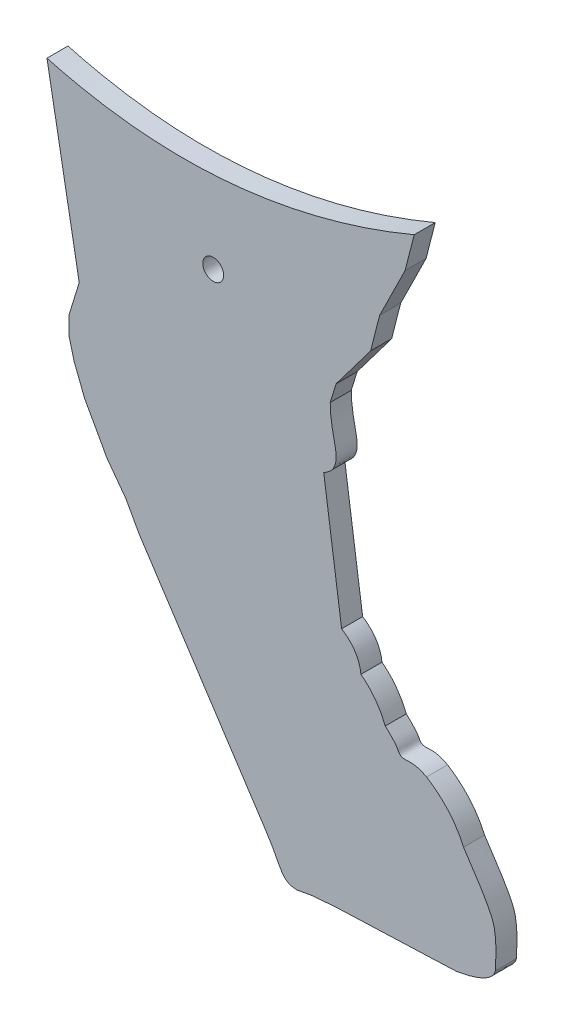
ISO-10303-21;
HEADER;
FILE_DESCRIPTION(('STEP AP214'),'2;1');
FILE_NAME('part.step','',(''),(''),'','','');
FILE_SCHEMA(('AUTOMOTIVE_DESIGN { 1 0 10303 214 1 1 1 1 }'));
ENDSEC;
DATA;
#1=APPLICATION_CONTEXT('core data for automotive mechanical design processes');
#2=APPLICATION_PROTOCOL_DEFINITION('international standard','automotive_design',2000,#1);
#3=PRODUCT_CONTEXT('',#1,'mechanical');
#4=PRODUCT('Part','Part','',(#3));
#5=PRODUCT_RELATED_PRODUCT_CATEGORY('part','',(#4));
#6=PRODUCT_DEFINITION_FORMATION('','',#4);
#7=PRODUCT_DEFINITION_CONTEXT('part definition',#1,'design');
#8=PRODUCT_DEFINITION('design','',#6,#7);
#9=PRODUCT_DEFINITION_SHAPE('','',#8);
#10=(LENGTH_UNIT() NAMED_UNIT(*) SI_UNIT(.MILLI.,.METRE.));
#11=(NAMED_UNIT(*) PLANE_ANGLE_UNIT() SI_UNIT($,.RADIAN.));
#12=(NAMED_UNIT(*) SI_UNIT($,.STERADIAN.) SOLID_ANGLE_UNIT());
#13=UNCERTAINTY_MEASURE_WITH_UNIT(LENGTH_MEASURE(1.E-05),#10,'distance_accuracy_value','');
#14=(GEOMETRIC_REPRESENTATION_CONTEXT(3) GLOBAL_UNCERTAINTY_ASSIGNED_CONTEXT((#13)) GLOBAL_UNIT_ASSIGNED_CONTEXT((#10,
#11,#12)) REPRESENTATION_CONTEXT('',''));
#15=CARTESIAN_POINT('',(0.,0.,0.));
#16=DIRECTION('',(0.,0.,1.));
#17=DIRECTION('',(1.,0.,0.));
#18=AXIS2_PLACEMENT_3D('',#15,#16,#17);
#19=CARTESIAN_POINT('',(117.41123998534,97.4180434664203,3.175));
#20=DIRECTION('',(0.,0.,-1.));
#21=DIRECTION('',(-1.,0.,0.));
#22=AXIS2_PLACEMENT_3D('',#19,#20,#21);
#23=PLANE('',#22);
#24=DIRECTION('',(0.178010170786204,-0.984028647497961,0.));
#25=VECTOR('',#24,1.);
#26=CARTESIAN_POINT('',(95.0150889180373,73.0396220276294,3.175));
#27=LINE('',#26,#25);
#28=CARTESIAN_POINT('',(90.1482637898344,99.9431148301081,3.175));
#29=VERTEX_POINT('',#28);
#30=CARTESIAN_POINT('',(95.0150889180373,73.0396220276294,3.175));
#31=VERTEX_POINT('',#30);
#32=EDGE_CURVE('E49',#29,#31,#27,.T.);
#33=ORIENTED_EDGE('',*,*,#32,.T.);
#34=DIRECTION('',(-0.29507306639433,-0.955474691181639,0.));
#35=VECTOR('',#34,1.);
#36=CARTESIAN_POINT('',(95.0150889180373,73.0396220276294,3.175));
#37=LINE('',#36,#35);
#38=CARTESIAN_POINT('',(93.4424301163472,67.9472030507279,3.175));
#39=VERTEX_POINT('',#38);
#40=EDGE_CURVE('E150',#31,#39,#37,.T.);
#41=ORIENTED_EDGE('',*,*,#40,.T.);
#42=DIRECTION('',(0.,-1.,0.));
#43=VECTOR('',#42,1.);
#44=CARTESIAN_POINT('',(93.4424301163472,67.9472030507279,3.175));
#45=LINE('',#44,#43);
#46=CARTESIAN_POINT('',(93.4424301163472,65.4009935622772,3.175));
#47=VERTEX_POINT('',#46);
#48=EDGE_CURVE('E379',#39,#47,#45,.T.);
#49=ORIENTED_EDGE('',*,*,#48,.T.);
#50=DIRECTION('',(0.253898128412099,-0.967230965379435,0.));
#51=VECTOR('',#50,1.);
#52=CARTESIAN_POINT('',(93.4424301163472,65.4009935622772,3.175));
#53=LINE('',#52,#51);
#54=CARTESIAN_POINT('',(94.2287595171923,62.4054529876292,3.175));
#55=VERTEX_POINT('',#54);
#56=EDGE_CURVE('E510',#47,#55,#53,.T.);
#57=ORIENTED_EDGE('',*,*,#56,.T.);
#58=DIRECTION('',(0.364080080432993,-0.931367647619298,0.));
#59=VECTOR('',#58,1.);
#60=CARTESIAN_POINT('',(94.2287595171923,62.4054529876292,3.175));
#61=LINE('',#60,#59);
#62=CARTESIAN_POINT('',(95.8388625760655,58.2865846974883,3.175));
#63=VERTEX_POINT('',#62);
#64=EDGE_CURVE('E512',#55,#63,#61,.T.);
#65=ORIENTED_EDGE('',*,*,#64,.T.);
#66=DIRECTION('',(0.482604753647132,-0.875838256618875,0.));
#67=VECTOR('',#66,1.);
#68=CARTESIAN_POINT('',(95.8388625760655,58.2865846974883,3.175));
#69=LINE('',#68,#67);
#70=CARTESIAN_POINT('',(99.1877429526815,52.2089869769629,3.175));
#71=VERTEX_POINT('',#70);
#72=EDGE_CURVE('E514',#63,#71,#69,.T.);
#73=ORIENTED_EDGE('',*,*,#72,.T.);
#74=DIRECTION('',(0.594007393769745,-0.804459580182171,0.));
#75=VECTOR('',#74,1.);
#76=CARTESIAN_POINT('',(99.1877429526815,52.2089869769629,3.175));
#77=LINE('',#76,#75);
#78=CARTESIAN_POINT('',(102.05460926846,48.3264122867838,3.175));
#79=VERTEX_POINT('',#78);
#80=EDGE_CURVE('E516',#71,#79,#77,.T.);
#81=ORIENTED_EDGE('',*,*,#80,.T.);
#82=DIRECTION('',(0.482604753647133,-0.875838256618875,0.));
#83=VECTOR('',#82,1.);
#84=CARTESIAN_POINT('',(102.05460926846,48.3264122867838,3.175));
#85=LINE('',#84,#83);
#86=CARTESIAN_POINT('',(104.044945001553,44.7143215119114,3.175));
#87=VERTEX_POINT('',#86);
#88=EDGE_CURVE('E518',#79,#87,#85,.T.);
#89=ORIENTED_EDGE('',*,*,#88,.T.);
#90=DIRECTION('',(0.547838296173329,-0.836584246352932,0.));
#91=VECTOR('',#90,1.);
#92=CARTESIAN_POINT('',(104.044945001553,44.7143215119114,3.175));
#93=LINE('',#92,#91);
#94=CARTESIAN_POINT('',(123.032849585327,15.7185722972348,3.175));
#95=VERTEX_POINT('',#94);
#96=EDGE_CURVE('E520',#87,#95,#93,.T.);
#97=ORIENTED_EDGE('',*,*,#96,.T.);
#98=CARTESIAN_POINT('',(123.032849585327,15.7185722972348,3.175));
#99=CARTESIAN_POINT('',(123.714332190955,14.7231725745055,3.175));
#100=CARTESIAN_POINT('',(125.027867192261,12.4170461110575,3.175));
#101=CARTESIAN_POINT('',(126.131331549657,9.9933385570712,3.175));
#102=CARTESIAN_POINT('',(127.965130811522,10.0937140941964,3.175));
#103=B_SPLINE_CURVE_WITH_KNOTS('',3,(#98,#99,#100,#101,#102),.UNSPECIFIED.,.F.,.F.,(4,1,4),(0.,
0.482545384202542,1.),.UNSPECIFIED.);
#104=CARTESIAN_POINT('',(127.965130811522,10.0937140941964,3.175));
#105=VERTEX_POINT('',#104);
#106=EDGE_CURVE('E522',#95,#105,#103,.T.);
#107=ORIENTED_EDGE('',*,*,#106,.T.);
#108=DIRECTION('',(0.984028647497961,0.178010170786204,0.));
#109=VECTOR('',#108,1.);
#110=CARTESIAN_POINT('',(127.965130811522,10.0937140941964,3.175));
#111=LINE('',#110,#109);
#112=CARTESIAN_POINT('',(130.045906785277,10.4701251747049,3.175));
#113=VERTEX_POINT('',#112);
#114=EDGE_CURVE('E527',#105,#113,#111,.T.);
#115=ORIENTED_EDGE('',*,*,#114,.T.);
#116=DIRECTION('',(0.996703768233982,0.0811270509027666,0.));
#117=VECTOR('',#116,1.);
#118=CARTESIAN_POINT('',(130.045906785277,10.4701251747049,3.175));
#119=LINE('',#118,#117);
#120=CARTESIAN_POINT('',(133.787640511658,10.7746848966196,3.175));
#121=VERTEX_POINT('',#120);
#122=EDGE_CURVE('E585',#113,#121,#119,.T.);
#123=ORIENTED_EDGE('',*,*,#122,.T.);
#124=DIRECTION('',(0.999268220076252,0.0382495012469378,0.));
#125=VECTOR('',#124,1.);
#126=CARTESIAN_POINT('',(133.787640511658,10.7746848966196,3.175));
#127=LINE('',#126,#125);
#128=CARTESIAN_POINT('',(151.974206763138,11.4708214038533,3.175));
#129=VERTEX_POINT('',#128);
#130=EDGE_CURVE('E593',#121,#129,#127,.T.);
#131=ORIENTED_EDGE('',*,*,#130,.T.);
#132=CARTESIAN_POINT('',(151.974206763138,11.4708214038533,3.175));
#133=CARTESIAN_POINT('',(153.413195636641,11.7402218243676,3.175));
#134=CARTESIAN_POINT('',(157.371014602599,12.4486515194922,3.175));
#135=CARTESIAN_POINT('',(157.829388483412,14.5021665055309,3.175));
#136=B_SPLINE_CURVE_WITH_KNOTS('',3,(#132,#133,#134,#135),.UNSPECIFIED.,.F.,.F.,(4,4),(0.,1.),.UNSPECIFIED.);
#137=CARTESIAN_POINT('',(157.829388483412,14.5021665055309,3.175));
#138=VERTEX_POINT('',#137);
#139=EDGE_CURVE('E594',#129,#138,#136,.T.);
#140=ORIENTED_EDGE('',*,*,#139,.T.);
#141=CARTESIAN_POINT('',(157.829388483412,14.5021665055309,3.175));
#142=CARTESIAN_POINT('',(157.900569473778,15.9257863128522,3.175));
#143=CARTESIAN_POINT('',(158.146330260825,19.3120875794455,3.175));
#144=CARTESIAN_POINT('',(156.16856343442,23.6544106319414,3.175));
#145=CARTESIAN_POINT('',(155.053521844869,25.0972584970971,3.175));
#146=CARTESIAN_POINT('',(153.017246456484,28.2462818121606,3.175));
#147=B_SPLINE_CURVE_WITH_KNOTS('',3,(#141,#142,#143,#144,#145,#146),.UNSPECIFIED.,.F.,.F.,(4,1,
1,4),(0.,0.406146074823536,0.454361820832265,1.),.UNSPECIFIED.);
#148=CARTESIAN_POINT('',(153.017246456484,28.2462818121606,3.175));
#149=VERTEX_POINT('',#148);
#150=EDGE_CURVE('E601',#138,#149,#147,.T.);
#151=ORIENTED_EDGE('',*,*,#150,.T.);
#152=CARTESIAN_POINT('',(153.017246456484,28.2462818121606,3.175));
#153=CARTESIAN_POINT('',(151.311718476034,32.1818133798678,3.175));
#154=CARTESIAN_POINT('',(147.43730753607,34.6374390405588,3.175));
#155=B_SPLINE_CURVE_WITH_KNOTS('',2,(#152,#153,#154),.UNSPECIFIED.,.F.,.F.,(3,3),(0.,1.),.UNSPECIFIED.);
#156=CARTESIAN_POINT('',(147.43730753607,34.6374390405588,3.175));
#157=VERTEX_POINT('',#156);
#158=EDGE_CURVE('E850',#149,#157,#155,.T.);
#159=ORIENTED_EDGE('',*,*,#158,.T.);
#160=CARTESIAN_POINT('',(147.43730753607,34.6374390405588,3.175));
#161=CARTESIAN_POINT('',(144.80785202241,36.0573450179352,3.175));
#162=CARTESIAN_POINT('',(143.864835089024,34.5581370649068,3.175));
#163=CARTESIAN_POINT('',(142.696530205708,36.8316825647036,3.175));
#164=CARTESIAN_POINT('',(142.057807777284,37.3364441145635,3.175));
#165=CARTESIAN_POINT('',(141.208586266716,38.1802017114105,3.175));
#166=B_SPLINE_CURVE_WITH_KNOTS('',3,(#160,#161,#162,#163,#164,#165),.UNSPECIFIED.,.F.,.F.,(4,1,
1,4),(0.,0.588995486540135,0.612005866871278,1.),.UNSPECIFIED.);
#167=CARTESIAN_POINT('',(141.208586266716,38.1802017114105,3.175));
#168=VERTEX_POINT('',#167);
#169=EDGE_CURVE('E835',#157,#168,#166,.T.);
#170=ORIENTED_EDGE('',*,*,#169,.T.);
#171=CARTESIAN_POINT('',(141.208586266716,38.1802017114105,3.175));
#172=CARTESIAN_POINT('',(139.984101629635,41.2453207408554,3.175));
#173=CARTESIAN_POINT('',(137.53610977751,43.0922610611387,3.175));
#174=B_SPLINE_CURVE_WITH_KNOTS('',2,(#171,#172,#173),.UNSPECIFIED.,.F.,.F.,(3,3),(0.,1.),.UNSPECIFIED.);
#175=CARTESIAN_POINT('',(137.53610977751,43.0922610611387,3.175));
#176=VERTEX_POINT('',#175);
#177=EDGE_CURVE('E834',#168,#176,#174,.T.);
#178=ORIENTED_EDGE('',*,*,#177,.T.);
#179=CARTESIAN_POINT('',(137.53610977751,43.0922610611387,3.175));
#180=CARTESIAN_POINT('',(137.229688432102,45.9166419246655,3.175));
#181=CARTESIAN_POINT('',(134.617377973838,47.5913974281166,3.175));
#182=B_SPLINE_CURVE_WITH_KNOTS('',2,(#179,#180,#181),.UNSPECIFIED.,.F.,.F.,(3,3),(0.,1.),.UNSPECIFIED.);
#183=CARTESIAN_POINT('',(134.617377973838,47.5913974281166,3.175));
#184=VERTEX_POINT('',#183);
#185=EDGE_CURVE('E833',#176,#184,#182,.T.);
#186=ORIENTED_EDGE('',*,*,#185,.T.);
#187=DIRECTION('',(-0.140124805820318,0.990133848928425,0.));
#188=VECTOR('',#187,1.);
#189=CARTESIAN_POINT('',(134.513357881547,48.3264122867838,3.175));
#190=LINE('',#189,#188);
#191=CARTESIAN_POINT('',(131.916773648468,66.6740983065025,3.175));
#192=VERTEX_POINT('',#191);
#193=EDGE_CURVE('E291',#184,#192,#190,.T.);
#194=ORIENTED_EDGE('',*,*,#193,.T.);
#195=CARTESIAN_POINT('',(131.916773648468,66.6740983065025,3.175));
#196=CARTESIAN_POINT('',(133.384180120025,67.4244104898078,3.175));
#197=CARTESIAN_POINT('',(134.383448091869,69.9754885600191,3.175));
#198=CARTESIAN_POINT('',(132.91594865375,73.1978625027874,3.175));
#199=CARTESIAN_POINT('',(132.897509942166,76.3148082465007,3.175));
#200=B_SPLINE_CURVE_WITH_KNOTS('',3,(#195,#196,#197,#198,#199),.UNSPECIFIED.,.F.,.F.,(4,1,4),
(0.,0.424676319605923,1.),.UNSPECIFIED.);
#201=CARTESIAN_POINT('',(132.897509942166,76.3148082465007,3.175));
#202=VERTEX_POINT('',#201);
#203=EDGE_CURVE('E284',#192,#202,#200,.T.);
#204=ORIENTED_EDGE('',*,*,#203,.T.);
#205=DIRECTION('',(0.295073066394331,0.955474691181638,0.));
#206=VECTOR('',#205,1.);
#207=CARTESIAN_POINT('',(133.787640511658,79.1971358048555,3.175));
#208=LINE('',#207,#206);
#209=CARTESIAN_POINT('',(133.787640511658,79.1971358048555,3.175));
#210=VERTEX_POINT('',#209);
#211=EDGE_CURVE('E290',#202,#210,#208,.T.);
#212=ORIENTED_EDGE('',*,*,#211,.T.);
#213=DIRECTION('',(0.6021846555456,0.798356837902342,0.));
#214=VECTOR('',#213,1.);
#215=CARTESIAN_POINT('',(133.787640511658,79.1971358048555,3.175));
#216=LINE('',#215,#214);
#217=CARTESIAN_POINT('',(138.995570312299,86.1016398126663,3.175));
#218=VERTEX_POINT('',#217);
#219=EDGE_CURVE('E297',#210,#218,#216,.T.);
#220=ORIENTED_EDGE('',*,*,#219,.T.);
#221=DIRECTION('',(0.247383245265818,0.968917710624464,0.));
#222=VECTOR('',#221,1.);
#223=CARTESIAN_POINT('',(138.995570312299,86.1016398126663,3.175));
#224=LINE('',#223,#222);
#225=CARTESIAN_POINT('',(140.361296403027,91.4507336680168,3.175));
#226=VERTEX_POINT('',#225);
#227=EDGE_CURVE('E227',#218,#226,#224,.T.);
#228=ORIENTED_EDGE('',*,*,#227,.T.);
#229=DIRECTION('',(0.44371231462562,0.896169281915852,0.));
#230=VECTOR('',#229,1.);
#231=CARTESIAN_POINT('',(140.361296403027,91.4507336680168,3.175));
#232=LINE('',#231,#230);
#233=CARTESIAN_POINT('',(144.200087545617,99.2039705926736,3.175));
#234=VERTEX_POINT('',#233);
#235=EDGE_CURVE('E221',#226,#234,#232,.T.);
#236=ORIENTED_EDGE('',*,*,#235,.T.);
#237=DIRECTION('',(0.247383245265817,0.968917710624464,0.));
#238=VECTOR('',#237,1.);
#239=CARTESIAN_POINT('',(144.200087545617,99.2039705926736,3.175));
#240=LINE('',#239,#238);
#241=CARTESIAN_POINT('',(145.57069602816,104.572187149301,3.175));
#242=VERTEX_POINT('',#241);
#243=EDGE_CURVE('E225',#234,#242,#240,.T.);
#244=ORIENTED_EDGE('',*,*,#243,.T.);
#245=CARTESIAN_POINT('',(145.57069602816,104.572187149301,3.175));
#246=CARTESIAN_POINT('',(116.963000061684,92.5784359431362,3.175));
#247=CARTESIAN_POINT('',(90.1482637898344,99.9431148301081,3.175));
#248=B_SPLINE_CURVE_WITH_KNOTS('',2,(#245,#246,#247),.UNSPECIFIED.,.F.,.F.,(3,3),(0.,1.),.UNSPECIFIED.);
#249=EDGE_CURVE('E240',#242,#29,#248,.T.);
#250=ORIENTED_EDGE('',*,*,#249,.T.);
#251=EDGE_LOOP('',(#33,#41,#49,#57,#65,#73,#81,#89,#97,#107,#115,#123,#131,#140,#151,#159,#170,
#178,#186,#194,#204,#212,#220,#228,#236,#244,#250));
#252=FACE_BOUND('',#251,.T.);
#253=CARTESIAN_POINT('',(115.239537292347,84.8848861814154,3.175));
#254=DIRECTION('',(0.,0.,1.));
#255=DIRECTION('',(1.,0.,0.));
#256=AXIS2_PLACEMENT_3D('',#253,#254,#255);
#257=CIRCLE('',#256,1.5748);
#258=CARTESIAN_POINT('',(116.814337292347,84.8848861814154,3.175));
#259=VERTEX_POINT('',#258);
#260=EDGE_CURVE('E390',#259,#259,#257,.T.);
#261=ORIENTED_EDGE('',*,*,#260,.F.);
#262=EDGE_LOOP('',(#261));
#263=FACE_BOUND('',#262,.T.);
#264=ADVANCED_FACE('F32',(#252,#263),#23,.F.);
#265=CARTESIAN_POINT('',(117.41123998534,97.4180434664203,0.));
#266=DIRECTION('',(0.,0.,-1.));
#267=DIRECTION('',(-1.,0.,0.));
#268=AXIS2_PLACEMENT_3D('',#265,#266,#267);
#269=PLANE('',#268);
#270=DIRECTION('',(-0.29507306639433,-0.955474691181639,0.));
#271=VECTOR('',#270,1.);
#272=CARTESIAN_POINT('',(95.0150889180373,73.0396220276294,0.));
#273=LINE('',#272,#271);
#274=CARTESIAN_POINT('',(95.0150889180373,73.0396220276294,0.));
#275=VERTEX_POINT('',#274);
#276=CARTESIAN_POINT('',(93.4424301163472,67.9472030507279,0.));
#277=VERTEX_POINT('',#276);
#278=EDGE_CURVE('E249',#275,#277,#273,.T.);
#279=ORIENTED_EDGE('',*,*,#278,.F.);
#280=DIRECTION('',(0.178010170786205,-0.984028647497961,0.));
#281=VECTOR('',#280,1.);
#282=CARTESIAN_POINT('',(92.4998069054663,86.9439374157592,0.));
#283=LINE('',#282,#281);
#284=CARTESIAN_POINT('',(90.1482637898344,99.9431148301081,0.));
#285=VERTEX_POINT('',#284);
#286=EDGE_CURVE('E476',#285,#275,#283,.T.);
#287=ORIENTED_EDGE('',*,*,#286,.F.);
#288=CARTESIAN_POINT('',(145.57069602816,104.572187149301,0.));
#289=CARTESIAN_POINT('',(116.963000061684,92.5784359431362,0.));
#290=CARTESIAN_POINT('',(90.1482637898344,99.9431148301081,0.));
#291=B_SPLINE_CURVE_WITH_KNOTS('',2,(#288,#289,#290),.UNSPECIFIED.,.F.,.F.,(3,3),(0.,1.),.UNSPECIFIED.);
#292=CARTESIAN_POINT('',(145.57069602816,104.572187149301,0.));
#293=VERTEX_POINT('',#292);
#294=EDGE_CURVE('E143',#293,#285,#291,.T.);
#295=ORIENTED_EDGE('',*,*,#294,.F.);
#296=DIRECTION('',(0.247383245265817,0.968917710624464,0.));
#297=VECTOR('',#296,1.);
#298=CARTESIAN_POINT('',(144.200087545617,99.2039705926736,0.));
#299=LINE('',#298,#297);
#300=CARTESIAN_POINT('',(144.200087545617,99.2039705926736,0.));
#301=VERTEX_POINT('',#300);
#302=EDGE_CURVE('E136',#301,#293,#299,.T.);
#303=ORIENTED_EDGE('',*,*,#302,.F.);
#304=DIRECTION('',(0.443712314625622,0.896169281915851,0.));
#305=VECTOR('',#304,1.);
#306=CARTESIAN_POINT('',(143.122445566602,97.0274485384886,0.));
#307=LINE('',#306,#305);
#308=CARTESIAN_POINT('',(140.361296403027,91.4507336680168,0.));
#309=VERTEX_POINT('',#308);
#310=EDGE_CURVE('E234',#309,#301,#307,.T.);
#311=ORIENTED_EDGE('',*,*,#310,.F.);
#312=DIRECTION('',(0.247383245265818,0.968917710624464,0.));
#313=VECTOR('',#312,1.);
#314=CARTESIAN_POINT('',(138.995570312299,86.1016398126663,0.));
#315=LINE('',#314,#313);
#316=CARTESIAN_POINT('',(138.995570312299,86.1016398126663,0.));
#317=VERTEX_POINT('',#316);
#318=EDGE_CURVE('E311',#317,#309,#315,.T.);
#319=ORIENTED_EDGE('',*,*,#318,.F.);
#320=DIRECTION('',(0.6021846555456,0.798356837902342,0.));
#321=VECTOR('',#320,1.);
#322=CARTESIAN_POINT('',(133.787640511658,79.1971358048555,0.));
#323=LINE('',#322,#321);
#324=CARTESIAN_POINT('',(133.787640511658,79.1971358048555,0.));
#325=VERTEX_POINT('',#324);
#326=EDGE_CURVE('E306',#325,#317,#323,.T.);
#327=ORIENTED_EDGE('',*,*,#326,.F.);
#328=DIRECTION('',(0.295073066394331,0.955474691181638,0.));
#329=VECTOR('',#328,1.);
#330=CARTESIAN_POINT('',(133.787640511658,79.1971358048555,0.));
#331=LINE('',#330,#329);
#332=CARTESIAN_POINT('',(132.897509942166,76.3148082465007,0.));
#333=VERTEX_POINT('',#332);
#334=EDGE_CURVE('E464',#333,#325,#331,.T.);
#335=ORIENTED_EDGE('',*,*,#334,.F.);
#336=CARTESIAN_POINT('',(131.916773648468,66.6740983065025,0.));
#337=CARTESIAN_POINT('',(133.384180120025,67.4244104898078,0.));
#338=CARTESIAN_POINT('',(134.383448091869,69.9754885600191,0.));
#339=CARTESIAN_POINT('',(132.91594865375,73.1978625027874,0.));
#340=CARTESIAN_POINT('',(132.897509942166,76.3148082465007,0.));
#341=B_SPLINE_CURVE_WITH_KNOTS('',3,(#336,#337,#338,#339,#340),.UNSPECIFIED.,.F.,.F.,(4,1,4),
(0.,0.424676319605923,1.),.UNSPECIFIED.);
#342=CARTESIAN_POINT('',(131.916773648468,66.6740983065025,0.));
#343=VERTEX_POINT('',#342);
#344=EDGE_CURVE('E460',#343,#333,#341,.T.);
#345=ORIENTED_EDGE('',*,*,#344,.F.);
#346=DIRECTION('',(-0.14012480582033,0.990133848928424,0.));
#347=VECTOR('',#346,1.);
#348=CARTESIAN_POINT('',(131.916773648468,66.6740983065025,0.));
#349=LINE('',#348,#347);
#350=CARTESIAN_POINT('',(134.617377973838,47.5913974281166,0.));
#351=VERTEX_POINT('',#350);
#352=EDGE_CURVE('E455',#351,#343,#349,.T.);
#353=ORIENTED_EDGE('',*,*,#352,.F.);
#354=CARTESIAN_POINT('',(137.53610977751,43.0922610611387,0.));
#355=CARTESIAN_POINT('',(137.229688432102,45.9166419246655,0.));
#356=CARTESIAN_POINT('',(134.617377973838,47.5913974281166,0.));
#357=B_SPLINE_CURVE_WITH_KNOTS('',2,(#354,#355,#356),.UNSPECIFIED.,.F.,.F.,(3,3),(0.,1.),.UNSPECIFIED.);
#358=CARTESIAN_POINT('',(137.53610977751,43.0922610611387,0.));
#359=VERTEX_POINT('',#358);
#360=EDGE_CURVE('E447',#359,#351,#357,.T.);
#361=ORIENTED_EDGE('',*,*,#360,.F.);
#362=CARTESIAN_POINT('',(141.208586266716,38.1802017114105,0.));
#363=CARTESIAN_POINT('',(139.984101629635,41.2453207408554,0.));
#364=CARTESIAN_POINT('',(137.53610977751,43.0922610611387,0.));
#365=B_SPLINE_CURVE_WITH_KNOTS('',2,(#362,#363,#364),.UNSPECIFIED.,.F.,.F.,(3,3),(0.,1.),.UNSPECIFIED.);
#366=CARTESIAN_POINT('',(141.208586266716,38.1802017114105,0.));
#367=VERTEX_POINT('',#366);
#368=EDGE_CURVE('E440',#367,#359,#365,.T.);
#369=ORIENTED_EDGE('',*,*,#368,.F.);
#370=CARTESIAN_POINT('',(147.43730753607,34.6374390405588,0.));
#371=CARTESIAN_POINT('',(144.80785202241,36.0573450179352,0.));
#372=CARTESIAN_POINT('',(143.864835089024,34.5581370649068,0.));
#373=CARTESIAN_POINT('',(142.696530205708,36.8316825647036,0.));
#374=CARTESIAN_POINT('',(142.057807777284,37.3364441145635,0.));
#375=CARTESIAN_POINT('',(141.208586266716,38.1802017114105,0.));
#376=B_SPLINE_CURVE_WITH_KNOTS('',3,(#370,#371,#372,#373,#374,#375),.UNSPECIFIED.,.F.,.F.,(4,1,
1,4),(0.,0.588995486540135,0.612005866871278,1.),.UNSPECIFIED.);
#377=CARTESIAN_POINT('',(147.43730753607,34.6374390405588,0.));
#378=VERTEX_POINT('',#377);
#379=EDGE_CURVE('E433',#378,#367,#376,.T.);
#380=ORIENTED_EDGE('',*,*,#379,.F.);
#381=CARTESIAN_POINT('',(153.017246456484,28.2462818121606,0.));
#382=CARTESIAN_POINT('',(151.311718476034,32.1818133798678,0.));
#383=CARTESIAN_POINT('',(147.43730753607,34.6374390405588,0.));
#384=B_SPLINE_CURVE_WITH_KNOTS('',2,(#381,#382,#383),.UNSPECIFIED.,.F.,.F.,(3,3),(0.,1.),.UNSPECIFIED.);
#385=CARTESIAN_POINT('',(153.017246456484,28.2462818121606,0.));
#386=VERTEX_POINT('',#385);
#387=EDGE_CURVE('E426',#386,#378,#384,.T.);
#388=ORIENTED_EDGE('',*,*,#387,.F.);
#389=CARTESIAN_POINT('',(157.829388483412,14.5021665055309,0.));
#390=CARTESIAN_POINT('',(157.900569473778,15.9257863128522,0.));
#391=CARTESIAN_POINT('',(158.146330260825,19.3120875794455,0.));
#392=CARTESIAN_POINT('',(156.16856343442,23.6544106319414,0.));
#393=CARTESIAN_POINT('',(155.053521844869,25.0972584970971,0.));
#394=CARTESIAN_POINT('',(153.017246456484,28.2462818121606,0.));
#395=B_SPLINE_CURVE_WITH_KNOTS('',3,(#389,#390,#391,#392,#393,#394),.UNSPECIFIED.,.F.,.F.,(4,1,
1,4),(0.,0.406146074823536,0.454361820832265,1.),.UNSPECIFIED.);
#396=CARTESIAN_POINT('',(157.829388483412,14.5021665055309,0.));
#397=VERTEX_POINT('',#396);
#398=EDGE_CURVE('E419',#397,#386,#395,.T.);
#399=ORIENTED_EDGE('',*,*,#398,.F.);
#400=CARTESIAN_POINT('',(151.974206763138,11.4708214038533,0.));
#401=CARTESIAN_POINT('',(153.413195636641,11.7402218243676,0.));
#402=CARTESIAN_POINT('',(157.371014602599,12.4486515194922,0.));
#403=CARTESIAN_POINT('',(157.829388483412,14.5021665055309,0.));
#404=B_SPLINE_CURVE_WITH_KNOTS('',3,(#400,#401,#402,#403),.UNSPECIFIED.,.F.,.F.,(4,4),(0.,1.),.UNSPECIFIED.);
#405=CARTESIAN_POINT('',(151.974206763138,11.4708214038533,0.));
#406=VERTEX_POINT('',#405);
#407=EDGE_CURVE('E415',#406,#397,#404,.T.);
#408=ORIENTED_EDGE('',*,*,#407,.F.);
#409=DIRECTION('',(0.999268220076252,0.0382495012469378,0.));
#410=VECTOR('',#409,1.);
#411=CARTESIAN_POINT('',(133.787640511658,10.7746848966196,0.));
#412=LINE('',#411,#410);
#413=CARTESIAN_POINT('',(133.787640511658,10.7746848966196,0.));
#414=VERTEX_POINT('',#413);
#415=EDGE_CURVE('E413',#414,#406,#412,.T.);
#416=ORIENTED_EDGE('',*,*,#415,.F.);
#417=DIRECTION('',(0.996703768233982,0.0811270509027666,0.));
#418=VECTOR('',#417,1.);
#419=CARTESIAN_POINT('',(130.045906785277,10.4701251747049,0.));
#420=LINE('',#419,#418);
#421=CARTESIAN_POINT('',(130.045906785277,10.4701251747049,0.));
#422=VERTEX_POINT('',#421);
#423=EDGE_CURVE('E411',#422,#414,#420,.T.);
#424=ORIENTED_EDGE('',*,*,#423,.F.);
#425=DIRECTION('',(0.984028647497961,0.178010170786204,0.));
#426=VECTOR('',#425,1.);
#427=CARTESIAN_POINT('',(127.965130811522,10.0937140941964,0.));
#428=LINE('',#427,#426);
#429=CARTESIAN_POINT('',(127.965130811522,10.0937140941964,0.));
#430=VERTEX_POINT('',#429);
#431=EDGE_CURVE('E406',#430,#422,#428,.T.);
#432=ORIENTED_EDGE('',*,*,#431,.F.);
#433=CARTESIAN_POINT('',(123.032849585327,15.7185722972348,0.));
#434=CARTESIAN_POINT('',(123.714332190955,14.7231725745055,0.));
#435=CARTESIAN_POINT('',(125.027867192261,12.4170461110575,0.));
#436=CARTESIAN_POINT('',(126.131331549657,9.9933385570712,0.));
#437=CARTESIAN_POINT('',(127.965130811522,10.0937140941964,0.));
#438=B_SPLINE_CURVE_WITH_KNOTS('',3,(#433,#434,#435,#436,#437),.UNSPECIFIED.,.F.,.F.,(4,1,4),
(0.,0.482545384202542,1.),.UNSPECIFIED.);
#439=CARTESIAN_POINT('',(123.032849585327,15.7185722972348,0.));
#440=VERTEX_POINT('',#439);
#441=EDGE_CURVE('E402',#440,#430,#438,.T.);
#442=ORIENTED_EDGE('',*,*,#441,.F.);
#443=DIRECTION('',(0.547838296173329,-0.836584246352932,0.));
#444=VECTOR('',#443,1.);
#445=CARTESIAN_POINT('',(104.044945001553,44.7143215119114,0.));
#446=LINE('',#445,#444);
#447=CARTESIAN_POINT('',(104.044945001553,44.7143215119114,0.));
#448=VERTEX_POINT('',#447);
#449=EDGE_CURVE('E400',#448,#440,#446,.T.);
#450=ORIENTED_EDGE('',*,*,#449,.F.);
#451=DIRECTION('',(0.482604753647133,-0.875838256618875,0.));
#452=VECTOR('',#451,1.);
#453=CARTESIAN_POINT('',(102.05460926846,48.3264122867838,0.));
#454=LINE('',#453,#452);
#455=CARTESIAN_POINT('',(102.05460926846,48.3264122867838,0.));
#456=VERTEX_POINT('',#455);
#457=EDGE_CURVE('E398',#456,#448,#454,.T.);
#458=ORIENTED_EDGE('',*,*,#457,.F.);
#459=DIRECTION('',(0.594007393769745,-0.804459580182171,0.));
#460=VECTOR('',#459,1.);
#461=CARTESIAN_POINT('',(99.1877429526815,52.2089869769629,0.));
#462=LINE('',#461,#460);
#463=CARTESIAN_POINT('',(99.1877429526815,52.2089869769629,0.));
#464=VERTEX_POINT('',#463);
#465=EDGE_CURVE('E396',#464,#456,#462,.T.);
#466=ORIENTED_EDGE('',*,*,#465,.F.);
#467=DIRECTION('',(0.482604753647132,-0.875838256618875,0.));
#468=VECTOR('',#467,1.);
#469=CARTESIAN_POINT('',(97.8608524639529,54.6170474935445,0.));
#470=LINE('',#469,#468);
#471=CARTESIAN_POINT('',(95.8388625760655,58.2865846974883,0.));
#472=VERTEX_POINT('',#471);
#473=EDGE_CURVE('E394',#472,#464,#470,.T.);
#474=ORIENTED_EDGE('',*,*,#473,.F.);
#475=DIRECTION('',(0.364080080432993,-0.931367647619298,0.));
#476=VECTOR('',#475,1.);
#477=CARTESIAN_POINT('',(94.2287595171923,62.4054529876292,0.));
#478=LINE('',#477,#476);
#479=CARTESIAN_POINT('',(94.2287595171923,62.4054529876292,0.));
#480=VERTEX_POINT('',#479);
#481=EDGE_CURVE('E388',#480,#472,#478,.T.);
#482=ORIENTED_EDGE('',*,*,#481,.F.);
#483=DIRECTION('',(0.253898128412099,-0.967230965379435,0.));
#484=VECTOR('',#483,1.);
#485=CARTESIAN_POINT('',(93.4424301163472,65.4009935622772,0.));
#486=LINE('',#485,#484);
#487=CARTESIAN_POINT('',(93.4424301163472,65.4009935622772,0.));
#488=VERTEX_POINT('',#487);
#489=EDGE_CURVE('E387',#488,#480,#486,.T.);
#490=ORIENTED_EDGE('',*,*,#489,.F.);
#491=DIRECTION('',(0.,-1.,0.));
#492=VECTOR('',#491,1.);
#493=CARTESIAN_POINT('',(93.4424301163472,67.9472030507279,0.));
#494=LINE('',#493,#492);
#495=EDGE_CURVE('E378',#277,#488,#494,.T.);
#496=ORIENTED_EDGE('',*,*,#495,.F.);
#497=EDGE_LOOP('',(#279,#287,#295,#303,#311,#319,#327,#335,#345,#353,#361,#369,#380,#388,#399,
#408,#416,#424,#432,#442,#450,#458,#466,#474,#482,#490,#496));
#498=FACE_BOUND('',#497,.T.);
#499=CARTESIAN_POINT('',(115.239537292347,84.8848861814154,0.));
#500=DIRECTION('',(0.,0.,1.));
#501=DIRECTION('',(1.,0.,0.));
#502=AXIS2_PLACEMENT_3D('',#499,#500,#501);
#503=CIRCLE('',#502,1.5748);
#504=CARTESIAN_POINT('',(116.814337292347,84.8848861814154,0.));
#505=VERTEX_POINT('',#504);
#506=EDGE_CURVE('E503',#505,#505,#503,.T.);
#507=ORIENTED_EDGE('',*,*,#506,.T.);
#508=EDGE_LOOP('',(#507));
#509=FACE_BOUND('',#508,.T.);
#510=ADVANCED_FACE('F383',(#498,#509),#269,.T.);
#511=CARTESIAN_POINT('',(95.0150889180373,73.0396220276294,3.175));
#512=DIRECTION('',(0.955474691181638,-0.29507306639433,0.));
#513=DIRECTION('',(0.29507306639433,0.955474691181639,0.));
#514=AXIS2_PLACEMENT_3D('',#511,#512,#513);
#515=PLANE('',#514);
#516=ORIENTED_EDGE('',*,*,#278,.T.);
#517=DIRECTION('',(0.,0.,-1.));
#518=VECTOR('',#517,1.);
#519=CARTESIAN_POINT('',(93.4424301163472,67.9472030507279,3.175));
#520=LINE('',#519,#518);
#521=EDGE_CURVE('E41',#39,#277,#520,.T.);
#522=ORIENTED_EDGE('',*,*,#521,.F.);
#523=ORIENTED_EDGE('',*,*,#40,.F.);
#524=DIRECTION('',(0.,0.,-1.));
#525=VECTOR('',#524,1.);
#526=CARTESIAN_POINT('',(95.0150889180373,73.0396220276294,3.175));
#527=LINE('',#526,#525);
#528=EDGE_CURVE('E11',#31,#275,#527,.T.);
#529=ORIENTED_EDGE('',*,*,#528,.T.);
#530=EDGE_LOOP('',(#516,#522,#523,#529));
#531=FACE_BOUND('',#530,.T.);
#532=ADVANCED_FACE('F34',(#531),#515,.F.);
#533=CARTESIAN_POINT('',(93.4424301163472,67.9472030507279,3.175));
#534=DIRECTION('',(1.,0.,0.));
#535=DIRECTION('',(0.,1.,0.));
#536=AXIS2_PLACEMENT_3D('',#533,#534,#535);
#537=PLANE('',#536);
#538=ORIENTED_EDGE('',*,*,#495,.T.);
#539=DIRECTION('',(0.,0.,-1.));
#540=VECTOR('',#539,1.);
#541=CARTESIAN_POINT('',(93.4424301163472,65.4009935622772,3.175));
#542=LINE('',#541,#540);
#543=EDGE_CURVE('E370',#47,#488,#542,.T.);
#544=ORIENTED_EDGE('',*,*,#543,.F.);
#545=ORIENTED_EDGE('',*,*,#48,.F.);
#546=ORIENTED_EDGE('',*,*,#521,.T.);
#547=EDGE_LOOP('',(#538,#544,#545,#546));
#548=FACE_BOUND('',#547,.T.);
#549=ADVANCED_FACE('F376',(#548),#537,.F.);
#550=CARTESIAN_POINT('',(93.4424301163472,65.4009935622772,3.175));
#551=DIRECTION('',(0.967230965379435,0.253898128412099,0.));
#552=DIRECTION('',(-0.253898128412099,0.967230965379435,0.));
#553=AXIS2_PLACEMENT_3D('',#550,#551,#552);
#554=PLANE('',#553);
#555=ORIENTED_EDGE('',*,*,#489,.T.);
#556=DIRECTION('',(0.,0.,-1.));
#557=VECTOR('',#556,1.);
#558=CARTESIAN_POINT('',(94.2287595171923,62.4054529876292,3.175));
#559=LINE('',#558,#557);
#560=EDGE_CURVE('E367',#55,#480,#559,.T.);
#561=ORIENTED_EDGE('',*,*,#560,.F.);
#562=ORIENTED_EDGE('',*,*,#56,.F.);
#563=ORIENTED_EDGE('',*,*,#543,.T.);
#564=EDGE_LOOP('',(#555,#561,#562,#563));
#565=FACE_BOUND('',#564,.T.);
#566=ADVANCED_FACE('F486',(#565),#554,.F.);
#567=CARTESIAN_POINT('',(94.2287595171923,62.4054529876292,3.175));
#568=DIRECTION('',(0.931367647619298,0.364080080432993,0.));
#569=DIRECTION('',(-0.364080080432993,0.931367647619298,0.));
#570=AXIS2_PLACEMENT_3D('',#567,#568,#569);
#571=PLANE('',#570);
#572=ORIENTED_EDGE('',*,*,#481,.T.);
#573=DIRECTION('',(0.,0.,-1.));
#574=VECTOR('',#573,1.);
#575=CARTESIAN_POINT('',(95.8388625760655,58.2865846974883,3.175));
#576=LINE('',#575,#574);
#577=EDGE_CURVE('E364',#63,#472,#576,.T.);
#578=ORIENTED_EDGE('',*,*,#577,.F.);
#579=ORIENTED_EDGE('',*,*,#64,.F.);
#580=ORIENTED_EDGE('',*,*,#560,.T.);
#581=EDGE_LOOP('',(#572,#578,#579,#580));
#582=FACE_BOUND('',#581,.T.);
#583=ADVANCED_FACE('F555',(#582),#571,.F.);
#584=CARTESIAN_POINT('',(97.8608524639529,54.6170474935445,3.175));
#585=DIRECTION('',(0.875838256618875,0.482604753647132,0.));
#586=DIRECTION('',(-0.482604753647132,0.875838256618876,0.));
#587=AXIS2_PLACEMENT_3D('',#584,#585,#586);
#588=PLANE('',#587);
#589=ORIENTED_EDGE('',*,*,#473,.T.);
#590=DIRECTION('',(0.,0.,-1.));
#591=VECTOR('',#590,1.);
#592=CARTESIAN_POINT('',(99.1877429526815,52.2089869769629,3.175));
#593=LINE('',#592,#591);
#594=EDGE_CURVE('E361',#71,#464,#593,.T.);
#595=ORIENTED_EDGE('',*,*,#594,.F.);
#596=ORIENTED_EDGE('',*,*,#72,.F.);
#597=ORIENTED_EDGE('',*,*,#577,.T.);
#598=EDGE_LOOP('',(#589,#595,#596,#597));
#599=FACE_BOUND('',#598,.T.);
#600=ADVANCED_FACE('F551',(#599),#588,.F.);
#601=CARTESIAN_POINT('',(99.1877429526815,52.2089869769629,3.175));
#602=DIRECTION('',(0.804459580182171,0.594007393769745,0.));
#603=DIRECTION('',(-0.594007393769745,0.804459580182171,0.));
#604=AXIS2_PLACEMENT_3D('',#601,#602,#603);
#605=PLANE('',#604);
#606=ORIENTED_EDGE('',*,*,#465,.T.);
#607=DIRECTION('',(0.,0.,-1.));
#608=VECTOR('',#607,1.);
#609=CARTESIAN_POINT('',(102.05460926846,48.3264122867838,3.175));
#610=LINE('',#609,#608);
#611=EDGE_CURVE('E358',#79,#456,#610,.T.);
#612=ORIENTED_EDGE('',*,*,#611,.F.);
#613=ORIENTED_EDGE('',*,*,#80,.F.);
#614=ORIENTED_EDGE('',*,*,#594,.T.);
#615=EDGE_LOOP('',(#606,#612,#613,#614));
#616=FACE_BOUND('',#615,.T.);
#617=ADVANCED_FACE('F547',(#616),#605,.F.);
#618=CARTESIAN_POINT('',(102.05460926846,48.3264122867838,3.175));
#619=DIRECTION('',(0.875838256618875,0.482604753647133,0.));
#620=DIRECTION('',(-0.482604753647133,0.875838256618875,0.));
#621=AXIS2_PLACEMENT_3D('',#618,#619,#620);
#622=PLANE('',#621);
#623=ORIENTED_EDGE('',*,*,#457,.T.);
#624=DIRECTION('',(0.,0.,-1.));
#625=VECTOR('',#624,1.);
#626=CARTESIAN_POINT('',(104.044945001553,44.7143215119114,3.175));
#627=LINE('',#626,#625);
#628=EDGE_CURVE('E355',#87,#448,#627,.T.);
#629=ORIENTED_EDGE('',*,*,#628,.F.);
#630=ORIENTED_EDGE('',*,*,#88,.F.);
#631=ORIENTED_EDGE('',*,*,#611,.T.);
#632=EDGE_LOOP('',(#623,#629,#630,#631));
#633=FACE_BOUND('',#632,.T.);
#634=ADVANCED_FACE('F543',(#633),#622,.F.);
#635=CARTESIAN_POINT('',(104.044945001553,44.7143215119114,3.175));
#636=DIRECTION('',(0.836584246352932,0.547838296173329,0.));
#637=DIRECTION('',(-0.547838296173329,0.836584246352933,0.));
#638=AXIS2_PLACEMENT_3D('',#635,#636,#637);
#639=PLANE('',#638);
#640=ORIENTED_EDGE('',*,*,#449,.T.);
#641=DIRECTION('',(0.,0.,-1.));
#642=VECTOR('',#641,1.);
#643=CARTESIAN_POINT('',(123.032849585327,15.7185722972348,3.175));
#644=LINE('',#643,#642);
#645=EDGE_CURVE('E352',#95,#440,#644,.T.);
#646=ORIENTED_EDGE('',*,*,#645,.F.);
#647=ORIENTED_EDGE('',*,*,#96,.F.);
#648=ORIENTED_EDGE('',*,*,#628,.T.);
#649=EDGE_LOOP('',(#640,#646,#647,#648));
#650=FACE_BOUND('',#649,.T.);
#651=ADVANCED_FACE('F538',(#650),#639,.F.);
#652=DIRECTION('',(0.,0.,-1.));
#653=VECTOR('',#652,1.);
#654=SURFACE_OF_LINEAR_EXTRUSION('',#103,#653);
#655=ORIENTED_EDGE('',*,*,#441,.T.);
#656=DIRECTION('',(0.,0.,-1.));
#657=VECTOR('',#656,1.);
#658=CARTESIAN_POINT('',(127.965130811522,10.0937140941964,3.175));
#659=LINE('',#658,#657);
#660=EDGE_CURVE('E349',#105,#430,#659,.T.);
#661=ORIENTED_EDGE('',*,*,#660,.F.);
#662=ORIENTED_EDGE('',*,*,#106,.F.);
#663=ORIENTED_EDGE('',*,*,#645,.T.);
#664=EDGE_LOOP('',(#655,#661,#662,#663));
#665=FACE_BOUND('',#664,.T.);
#666=ADVANCED_FACE('F533',(#665),#654,.F.);
#667=CARTESIAN_POINT('',(127.965130811522,10.0937140941964,3.175));
#668=DIRECTION('',(-0.178010170786204,0.984028647497961,0.));
#669=DIRECTION('',(-0.984028647497961,-0.178010170786205,0.));
#670=AXIS2_PLACEMENT_3D('',#667,#668,#669);
#671=PLANE('',#670);
#672=ORIENTED_EDGE('',*,*,#431,.T.);
#673=DIRECTION('',(0.,0.,-1.));
#674=VECTOR('',#673,1.);
#675=CARTESIAN_POINT('',(130.045906785277,10.4701251747049,3.175));
#676=LINE('',#675,#674);
#677=EDGE_CURVE('E346',#113,#422,#676,.T.);
#678=ORIENTED_EDGE('',*,*,#677,.F.);
#679=ORIENTED_EDGE('',*,*,#114,.F.);
#680=ORIENTED_EDGE('',*,*,#660,.T.);
#681=EDGE_LOOP('',(#672,#678,#679,#680));
#682=FACE_BOUND('',#681,.T.);
#683=ADVANCED_FACE('F537',(#682),#671,.F.);
#684=CARTESIAN_POINT('',(130.045906785277,10.4701251747049,3.175));
#685=DIRECTION('',(-0.0811270509027666,0.996703768233982,0.));
#686=DIRECTION('',(-0.996703768233982,-0.0811270509027666,0.));
#687=AXIS2_PLACEMENT_3D('',#684,#685,#686);
#688=PLANE('',#687);
#689=ORIENTED_EDGE('',*,*,#423,.T.);
#690=DIRECTION('',(0.,0.,-1.));
#691=VECTOR('',#690,1.);
#692=CARTESIAN_POINT('',(133.787640511658,10.7746848966196,3.175));
#693=LINE('',#692,#691);
#694=EDGE_CURVE('E343',#121,#414,#693,.T.);
#695=ORIENTED_EDGE('',*,*,#694,.F.);
#696=ORIENTED_EDGE('',*,*,#122,.F.);
#697=ORIENTED_EDGE('',*,*,#677,.T.);
#698=EDGE_LOOP('',(#689,#695,#696,#697));
#699=FACE_BOUND('',#698,.T.);
#700=ADVANCED_FACE('F591',(#699),#688,.F.);
#701=CARTESIAN_POINT('',(133.787640511658,10.7746848966196,3.175));
#702=DIRECTION('',(-0.0382495012469378,0.999268220076252,0.));
#703=DIRECTION('',(-0.999268220076252,-0.0382495012469378,0.));
#704=AXIS2_PLACEMENT_3D('',#701,#702,#703);
#705=PLANE('',#704);
#706=ORIENTED_EDGE('',*,*,#415,.T.);
#707=DIRECTION('',(0.,0.,-1.));
#708=VECTOR('',#707,1.);
#709=CARTESIAN_POINT('',(151.974206763138,11.4708214038533,3.175));
#710=LINE('',#709,#708);
#711=EDGE_CURVE('E340',#129,#406,#710,.T.);
#712=ORIENTED_EDGE('',*,*,#711,.F.);
#713=ORIENTED_EDGE('',*,*,#130,.F.);
#714=ORIENTED_EDGE('',*,*,#694,.T.);
#715=EDGE_LOOP('',(#706,#712,#713,#714));
#716=FACE_BOUND('',#715,.T.);
#717=ADVANCED_FACE('F615',(#716),#705,.F.);
#718=DIRECTION('',(0.,0.,-1.));
#719=VECTOR('',#718,1.);
#720=SURFACE_OF_LINEAR_EXTRUSION('',#136,#719);
#721=ORIENTED_EDGE('',*,*,#407,.T.);
#722=DIRECTION('',(0.,0.,-1.));
#723=VECTOR('',#722,1.);
#724=CARTESIAN_POINT('',(157.829388483412,14.5021665055309,3.175));
#725=LINE('',#724,#723);
#726=EDGE_CURVE('E337',#138,#397,#725,.T.);
#727=ORIENTED_EDGE('',*,*,#726,.F.);
#728=ORIENTED_EDGE('',*,*,#139,.F.);
#729=ORIENTED_EDGE('',*,*,#711,.T.);
#730=EDGE_LOOP('',(#721,#727,#728,#729));
#731=FACE_BOUND('',#730,.T.);
#732=ADVANCED_FACE('F610',(#731),#720,.F.);
#733=DIRECTION('',(0.,0.,-1.));
#734=VECTOR('',#733,1.);
#735=SURFACE_OF_LINEAR_EXTRUSION('',#147,#734);
#736=ORIENTED_EDGE('',*,*,#398,.T.);
#737=DIRECTION('',(0.,0.,-1.));
#738=VECTOR('',#737,1.);
#739=CARTESIAN_POINT('',(153.017246456484,28.2462818121606,3.175));
#740=LINE('',#739,#738);
#741=EDGE_CURVE('E334',#149,#386,#740,.T.);
#742=ORIENTED_EDGE('',*,*,#741,.F.);
#743=ORIENTED_EDGE('',*,*,#150,.F.);
#744=ORIENTED_EDGE('',*,*,#726,.T.);
#745=EDGE_LOOP('',(#736,#742,#743,#744));
#746=FACE_BOUND('',#745,.T.);
#747=ADVANCED_FACE('F614',(#746),#735,.F.);
#748=DIRECTION('',(0.,0.,-1.));
#749=VECTOR('',#748,1.);
#750=SURFACE_OF_LINEAR_EXTRUSION('',#155,#749);
#751=ORIENTED_EDGE('',*,*,#387,.T.);
#752=DIRECTION('',(0.,0.,-1.));
#753=VECTOR('',#752,1.);
#754=CARTESIAN_POINT('',(147.43730753607,34.6374390405588,3.175));
#755=LINE('',#754,#753);
#756=EDGE_CURVE('E331',#157,#378,#755,.T.);
#757=ORIENTED_EDGE('',*,*,#756,.F.);
#758=ORIENTED_EDGE('',*,*,#158,.F.);
#759=ORIENTED_EDGE('',*,*,#741,.T.);
#760=EDGE_LOOP('',(#751,#757,#758,#759));
#761=FACE_BOUND('',#760,.T.);
#762=ADVANCED_FACE('F713',(#761),#750,.F.);
#763=DIRECTION('',(0.,0.,-1.));
#764=VECTOR('',#763,1.);
#765=SURFACE_OF_LINEAR_EXTRUSION('',#166,#764);
#766=ORIENTED_EDGE('',*,*,#379,.T.);
#767=DIRECTION('',(0.,0.,-1.));
#768=VECTOR('',#767,1.);
#769=CARTESIAN_POINT('',(141.208586266716,38.1802017114105,3.175));
#770=LINE('',#769,#768);
#771=EDGE_CURVE('E328',#168,#367,#770,.T.);
#772=ORIENTED_EDGE('',*,*,#771,.F.);
#773=ORIENTED_EDGE('',*,*,#169,.F.);
#774=ORIENTED_EDGE('',*,*,#756,.T.);
#775=EDGE_LOOP('',(#766,#772,#773,#774));
#776=FACE_BOUND('',#775,.T.);
#777=ADVANCED_FACE('F721',(#776),#765,.F.);
#778=DIRECTION('',(0.,0.,-1.));
#779=VECTOR('',#778,1.);
#780=SURFACE_OF_LINEAR_EXTRUSION('',#174,#779);
#781=ORIENTED_EDGE('',*,*,#368,.T.);
#782=DIRECTION('',(0.,0.,-1.));
#783=VECTOR('',#782,1.);
#784=CARTESIAN_POINT('',(137.53610977751,43.0922610611387,3.175));
#785=LINE('',#784,#783);
#786=EDGE_CURVE('E325',#176,#359,#785,.T.);
#787=ORIENTED_EDGE('',*,*,#786,.F.);
#788=ORIENTED_EDGE('',*,*,#177,.F.);
#789=ORIENTED_EDGE('',*,*,#771,.T.);
#790=EDGE_LOOP('',(#781,#787,#788,#789));
#791=FACE_BOUND('',#790,.T.);
#792=ADVANCED_FACE('F729',(#791),#780,.F.);
#793=DIRECTION('',(0.,0.,-1.));
#794=VECTOR('',#793,1.);
#795=SURFACE_OF_LINEAR_EXTRUSION('',#182,#794);
#796=ORIENTED_EDGE('',*,*,#360,.T.);
#797=DIRECTION('',(0.,0.,-1.));
#798=VECTOR('',#797,1.);
#799=CARTESIAN_POINT('',(134.617377973838,47.5913974281166,3.175));
#800=LINE('',#799,#798);
#801=EDGE_CURVE('E322',#184,#351,#800,.T.);
#802=ORIENTED_EDGE('',*,*,#801,.F.);
#803=ORIENTED_EDGE('',*,*,#185,.F.);
#804=ORIENTED_EDGE('',*,*,#786,.T.);
#805=EDGE_LOOP('',(#796,#802,#803,#804));
#806=FACE_BOUND('',#805,.T.);
#807=ADVANCED_FACE('F738',(#806),#795,.F.);
#808=CARTESIAN_POINT('',(131.916773648468,66.6740983065025,3.175));
#809=DIRECTION('',(-0.990133848928424,-0.14012480582033,0.));
#810=DIRECTION('',(0.14012480582033,-0.990133848928424,0.));
#811=AXIS2_PLACEMENT_3D('',#808,#809,#810);
#812=PLANE('',#811);
#813=ORIENTED_EDGE('',*,*,#352,.T.);
#814=DIRECTION('',(0.,0.,-1.));
#815=VECTOR('',#814,1.);
#816=CARTESIAN_POINT('',(131.916773648468,66.6740983065025,3.175));
#817=LINE('',#816,#815);
#818=EDGE_CURVE('E319',#192,#343,#817,.T.);
#819=ORIENTED_EDGE('',*,*,#818,.F.);
#820=ORIENTED_EDGE('',*,*,#193,.F.);
#821=ORIENTED_EDGE('',*,*,#801,.T.);
#822=EDGE_LOOP('',(#813,#819,#820,#821));
#823=FACE_BOUND('',#822,.T.);
#824=ADVANCED_FACE('F281',(#823),#812,.F.);
#825=DIRECTION('',(0.,0.,-1.));
#826=VECTOR('',#825,1.);
#827=SURFACE_OF_LINEAR_EXTRUSION('',#200,#826);
#828=ORIENTED_EDGE('',*,*,#344,.T.);
#829=DIRECTION('',(0.,0.,-1.));
#830=VECTOR('',#829,1.);
#831=CARTESIAN_POINT('',(132.897509942166,76.3148082465007,3.175));
#832=LINE('',#831,#830);
#833=EDGE_CURVE('E316',#202,#333,#832,.T.);
#834=ORIENTED_EDGE('',*,*,#833,.F.);
#835=ORIENTED_EDGE('',*,*,#203,.F.);
#836=ORIENTED_EDGE('',*,*,#818,.T.);
#837=EDGE_LOOP('',(#828,#834,#835,#836));
#838=FACE_BOUND('',#837,.T.);
#839=ADVANCED_FACE('F276',(#838),#827,.F.);
#840=CARTESIAN_POINT('',(133.787640511658,79.1971358048555,3.175));
#841=DIRECTION('',(-0.955474691181638,0.295073066394331,0.));
#842=DIRECTION('',(-0.295073066394331,-0.955474691181638,0.));
#843=AXIS2_PLACEMENT_3D('',#840,#841,#842);
#844=PLANE('',#843);
#845=ORIENTED_EDGE('',*,*,#334,.T.);
#846=DIRECTION('',(0.,0.,-1.));
#847=VECTOR('',#846,1.);
#848=CARTESIAN_POINT('',(133.787640511658,79.1971358048555,3.175));
#849=LINE('',#848,#847);
#850=EDGE_CURVE('E309',#210,#325,#849,.T.);
#851=ORIENTED_EDGE('',*,*,#850,.F.);
#852=ORIENTED_EDGE('',*,*,#211,.F.);
#853=ORIENTED_EDGE('',*,*,#833,.T.);
#854=EDGE_LOOP('',(#845,#851,#852,#853));
#855=FACE_BOUND('',#854,.T.);
#856=ADVANCED_FACE('F272',(#855),#844,.F.);
#857=CARTESIAN_POINT('',(133.787640511658,79.1971358048555,3.175));
#858=DIRECTION('',(-0.798356837902342,0.6021846555456,0.));
#859=DIRECTION('',(-0.6021846555456,-0.798356837902342,0.));
#860=AXIS2_PLACEMENT_3D('',#857,#858,#859);
#861=PLANE('',#860);
#862=ORIENTED_EDGE('',*,*,#326,.T.);
#863=DIRECTION('',(0.,0.,-1.));
#864=VECTOR('',#863,1.);
#865=CARTESIAN_POINT('',(138.995570312299,86.1016398126663,3.175));
#866=LINE('',#865,#864);
#867=EDGE_CURVE('E304',#218,#317,#866,.T.);
#868=ORIENTED_EDGE('',*,*,#867,.F.);
#869=ORIENTED_EDGE('',*,*,#219,.F.);
#870=ORIENTED_EDGE('',*,*,#850,.T.);
#871=EDGE_LOOP('',(#862,#868,#869,#870));
#872=FACE_BOUND('',#871,.T.);
#873=ADVANCED_FACE('F268',(#872),#861,.F.);
#874=CARTESIAN_POINT('',(138.995570312299,86.1016398126663,3.175));
#875=DIRECTION('',(-0.968917710624464,0.247383245265818,0.));
#876=DIRECTION('',(-0.247383245265818,-0.968917710624464,0.));
#877=AXIS2_PLACEMENT_3D('',#874,#875,#876);
#878=PLANE('',#877);
#879=ORIENTED_EDGE('',*,*,#318,.T.);
#880=DIRECTION('',(0.,0.,-1.));
#881=VECTOR('',#880,1.);
#882=CARTESIAN_POINT('',(140.361296403027,91.4507336680168,3.175));
#883=LINE('',#882,#881);
#884=EDGE_CURVE('E235',#226,#309,#883,.T.);
#885=ORIENTED_EDGE('',*,*,#884,.F.);
#886=ORIENTED_EDGE('',*,*,#227,.F.);
#887=ORIENTED_EDGE('',*,*,#867,.T.);
#888=EDGE_LOOP('',(#879,#885,#886,#887));
#889=FACE_BOUND('',#888,.T.);
#890=ADVANCED_FACE('F265',(#889),#878,.F.);
#891=CARTESIAN_POINT('',(143.122445566602,97.0274485384886,3.175));
#892=DIRECTION('',(-0.896169281915851,0.443712314625622,0.));
#893=DIRECTION('',(-0.443712314625622,-0.896169281915851,0.));
#894=AXIS2_PLACEMENT_3D('',#891,#892,#893);
#895=PLANE('',#894);
#896=ORIENTED_EDGE('',*,*,#310,.T.);
#897=DIRECTION('',(0.,0.,-1.));
#898=VECTOR('',#897,1.);
#899=CARTESIAN_POINT('',(144.200087545617,99.2039705926736,3.175));
#900=LINE('',#899,#898);
#901=EDGE_CURVE('E232',#234,#301,#900,.T.);
#902=ORIENTED_EDGE('',*,*,#901,.F.);
#903=ORIENTED_EDGE('',*,*,#235,.F.);
#904=ORIENTED_EDGE('',*,*,#884,.T.);
#905=EDGE_LOOP('',(#896,#902,#903,#904));
#906=FACE_BOUND('',#905,.T.);
#907=ADVANCED_FACE('F233',(#906),#895,.F.);
#908=CARTESIAN_POINT('',(144.200087545617,99.2039705926736,3.175));
#909=DIRECTION('',(-0.968917710624464,0.247383245265817,0.));
#910=DIRECTION('',(-0.247383245265817,-0.968917710624464,0.));
#911=AXIS2_PLACEMENT_3D('',#908,#909,#910);
#912=PLANE('',#911);
#913=ORIENTED_EDGE('',*,*,#302,.T.);
#914=DIRECTION('',(0.,0.,-1.));
#915=VECTOR('',#914,1.);
#916=CARTESIAN_POINT('',(145.57069602816,104.572187149301,3.175));
#917=LINE('',#916,#915);
#918=EDGE_CURVE('E236',#242,#293,#917,.T.);
#919=ORIENTED_EDGE('',*,*,#918,.F.);
#920=ORIENTED_EDGE('',*,*,#243,.F.);
#921=ORIENTED_EDGE('',*,*,#901,.T.);
#922=EDGE_LOOP('',(#913,#919,#920,#921));
#923=FACE_BOUND('',#922,.T.);
#924=ADVANCED_FACE('F238',(#923),#912,.F.);
#925=DIRECTION('',(0.,0.,-1.));
#926=VECTOR('',#925,1.);
#927=SURFACE_OF_LINEAR_EXTRUSION('',#248,#926);
#928=ORIENTED_EDGE('',*,*,#294,.T.);
#929=DIRECTION('',(0.,0.,-1.));
#930=VECTOR('',#929,1.);
#931=CARTESIAN_POINT('',(90.1482637898344,99.9431148301081,3.175));
#932=LINE('',#931,#930);
#933=EDGE_CURVE('E242',#29,#285,#932,.T.);
#934=ORIENTED_EDGE('',*,*,#933,.F.);
#935=ORIENTED_EDGE('',*,*,#249,.F.);
#936=ORIENTED_EDGE('',*,*,#918,.T.);
#937=EDGE_LOOP('',(#928,#934,#935,#936));
#938=FACE_BOUND('',#937,.T.);
#939=ADVANCED_FACE('F255',(#938),#927,.F.);
#940=CARTESIAN_POINT('',(92.4998069054663,86.9439374157592,3.175));
#941=DIRECTION('',(0.984028647497961,0.178010170786205,0.));
#942=DIRECTION('',(-0.178010170786205,0.984028647497961,0.));
#943=AXIS2_PLACEMENT_3D('',#940,#941,#942);
#944=PLANE('',#943);
#945=ORIENTED_EDGE('',*,*,#286,.T.);
#946=ORIENTED_EDGE('',*,*,#528,.F.);
#947=ORIENTED_EDGE('',*,*,#32,.F.);
#948=ORIENTED_EDGE('',*,*,#933,.T.);
#949=EDGE_LOOP('',(#945,#946,#947,#948));
#950=FACE_BOUND('',#949,.T.);
#951=ADVANCED_FACE('F259',(#950),#944,.F.);
#952=CARTESIAN_POINT('',(115.239537292347,84.8848861814154,3.175));
#953=DIRECTION('',(0.,0.,-1.));
#954=DIRECTION('',(-1.,0.,0.));
#955=AXIS2_PLACEMENT_3D('',#952,#953,#954);
#956=CYLINDRICAL_SURFACE('',#955,1.5748);
#957=ORIENTED_EDGE('',*,*,#260,.T.);
#958=EDGE_LOOP('',(#957));
#959=FACE_BOUND('',#958,.T.);
#960=ORIENTED_EDGE('',*,*,#506,.F.);
#961=EDGE_LOOP('',(#960));
#962=FACE_BOUND('',#961,.T.);
#963=ADVANCED_FACE('F492',(#959,#962),#956,.F.);
#964=CLOSED_SHELL('',(#264,#510,#532,#549,#566,#583,#600,#617,#634,#651,#666,#683,#700,#717,
#732,#747,#762,#777,#792,#807,#824,#839,#856,#873,#890,#907,#924,#939,#951,#963));
#965=MANIFOLD_SOLID_BREP('B2',#964);
#966=ADVANCED_BREP_SHAPE_REPRESENTATION('',(#18,#965),#14);
#967=SHAPE_DEFINITION_REPRESENTATION(#9,#966);
ENDSEC;
END-ISO-10303-21;
